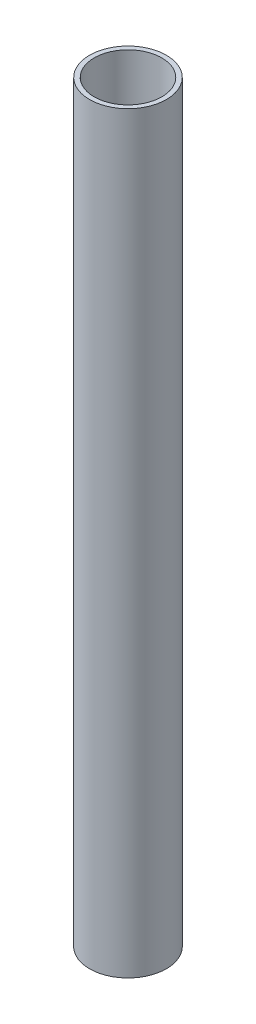
ISO-10303-21;
HEADER;
FILE_DESCRIPTION(('STEP AP214'),'2;1');
FILE_NAME('part.step','',(''),(''),'','','');
FILE_SCHEMA(('AUTOMOTIVE_DESIGN { 1 0 10303 214 1 1 1 1 }'));
ENDSEC;
DATA;
#1=APPLICATION_CONTEXT('core data for automotive mechanical design processes');
#2=APPLICATION_PROTOCOL_DEFINITION('international standard','automotive_design',2000,#1);
#3=PRODUCT_CONTEXT('',#1,'mechanical');
#4=PRODUCT('Part','Part','',(#3));
#5=PRODUCT_RELATED_PRODUCT_CATEGORY('part','',(#4));
#6=PRODUCT_DEFINITION_FORMATION('','',#4);
#7=PRODUCT_DEFINITION_CONTEXT('part definition',#1,'design');
#8=PRODUCT_DEFINITION('design','',#6,#7);
#9=PRODUCT_DEFINITION_SHAPE('','',#8);
#10=(LENGTH_UNIT() NAMED_UNIT(*) SI_UNIT(.MILLI.,.METRE.));
#11=(NAMED_UNIT(*) PLANE_ANGLE_UNIT() SI_UNIT($,.RADIAN.));
#12=(NAMED_UNIT(*) SI_UNIT($,.STERADIAN.) SOLID_ANGLE_UNIT());
#13=UNCERTAINTY_MEASURE_WITH_UNIT(LENGTH_MEASURE(1.E-05),#10,'distance_accuracy_value','');
#14=(GEOMETRIC_REPRESENTATION_CONTEXT(3) GLOBAL_UNCERTAINTY_ASSIGNED_CONTEXT((#13)) GLOBAL_UNIT_ASSIGNED_CONTEXT((#10,
#11,#12)) REPRESENTATION_CONTEXT('',''));
#15=CARTESIAN_POINT('',(0.,0.,0.));
#16=DIRECTION('',(0.,0.,1.));
#17=DIRECTION('',(1.,0.,0.));
#18=AXIS2_PLACEMENT_3D('',#15,#16,#17);
#19=CARTESIAN_POINT('',(0.,245.,0.));
#20=DIRECTION('',(0.,1.,0.));
#21=DIRECTION('',(0.,0.,1.));
#22=AXIS2_PLACEMENT_3D('',#19,#20,#21);
#23=PLANE('',#22);
#24=CARTESIAN_POINT('',(0.,245.,0.));
#25=DIRECTION('',(0.,1.,0.));
#26=DIRECTION('',(0.,0.,1.));
#27=AXIS2_PLACEMENT_3D('',#24,#25,#26);
#28=CIRCLE('',#27,12.5);
#29=CARTESIAN_POINT('',(0.,245.,12.5));
#30=VERTEX_POINT('',#29);
#31=EDGE_CURVE('E10',#30,#30,#28,.T.);
#32=ORIENTED_EDGE('',*,*,#31,.T.);
#33=EDGE_LOOP('',(#32));
#34=FACE_BOUND('',#33,.T.);
#35=CARTESIAN_POINT('',(0.,245.,0.));
#36=DIRECTION('',(0.,1.,0.));
#37=DIRECTION('',(0.,0.,1.));
#38=AXIS2_PLACEMENT_3D('',#35,#36,#37);
#39=CIRCLE('',#38,11.);
#40=CARTESIAN_POINT('',(0.,245.,11.));
#41=VERTEX_POINT('',#40);
#42=EDGE_CURVE('E43',#41,#41,#39,.T.);
#43=ORIENTED_EDGE('',*,*,#42,.F.);
#44=EDGE_LOOP('',(#43));
#45=FACE_BOUND('',#44,.T.);
#46=ADVANCED_FACE('F32',(#34,#45),#23,.T.);
#47=CARTESIAN_POINT('',(0.,0.,0.));
#48=DIRECTION('',(0.,1.,0.));
#49=DIRECTION('',(0.,0.,1.));
#50=AXIS2_PLACEMENT_3D('',#47,#48,#49);
#51=PLANE('',#50);
#52=CARTESIAN_POINT('',(0.,0.,0.));
#53=DIRECTION('',(0.,1.,0.));
#54=DIRECTION('',(0.,0.,1.));
#55=AXIS2_PLACEMENT_3D('',#52,#53,#54);
#56=CIRCLE('',#55,12.5);
#57=CARTESIAN_POINT('',(0.,0.,12.5));
#58=VERTEX_POINT('',#57);
#59=EDGE_CURVE('E36',#58,#58,#56,.T.);
#60=ORIENTED_EDGE('',*,*,#59,.F.);
#61=EDGE_LOOP('',(#60));
#62=FACE_BOUND('',#61,.T.);
#63=CARTESIAN_POINT('',(0.,0.,0.));
#64=DIRECTION('',(0.,1.,0.));
#65=DIRECTION('',(0.,0.,1.));
#66=AXIS2_PLACEMENT_3D('',#63,#64,#65);
#67=CIRCLE('',#66,11.);
#68=CARTESIAN_POINT('',(0.,0.,11.));
#69=VERTEX_POINT('',#68);
#70=EDGE_CURVE('E45',#69,#69,#67,.T.);
#71=ORIENTED_EDGE('',*,*,#70,.T.);
#72=EDGE_LOOP('',(#71));
#73=FACE_BOUND('',#72,.T.);
#74=ADVANCED_FACE('F55',(#62,#73),#51,.F.);
#75=CARTESIAN_POINT('',(0.,245.,0.));
#76=DIRECTION('',(0.,-1.,0.));
#77=DIRECTION('',(0.,0.,-1.));
#78=AXIS2_PLACEMENT_3D('',#75,#76,#77);
#79=CYLINDRICAL_SURFACE('',#78,12.5);
#80=ORIENTED_EDGE('',*,*,#31,.F.);
#81=EDGE_LOOP('',(#80));
#82=FACE_BOUND('',#81,.T.);
#83=ORIENTED_EDGE('',*,*,#59,.T.);
#84=EDGE_LOOP('',(#83));
#85=FACE_BOUND('',#84,.T.);
#86=ADVANCED_FACE('F34',(#82,#85),#79,.T.);
#87=CARTESIAN_POINT('',(0.,245.,0.));
#88=DIRECTION('',(0.,-1.,0.));
#89=DIRECTION('',(0.,0.,-1.));
#90=AXIS2_PLACEMENT_3D('',#87,#88,#89);
#91=CYLINDRICAL_SURFACE('',#90,11.);
#92=ORIENTED_EDGE('',*,*,#42,.T.);
#93=EDGE_LOOP('',(#92));
#94=FACE_BOUND('',#93,.T.);
#95=ORIENTED_EDGE('',*,*,#70,.F.);
#96=EDGE_LOOP('',(#95));
#97=FACE_BOUND('',#96,.T.);
#98=ADVANCED_FACE('F51',(#94,#97),#91,.F.);
#99=CLOSED_SHELL('',(#46,#74,#86,#98));
#100=MANIFOLD_SOLID_BREP('B2',#99);
#101=ADVANCED_BREP_SHAPE_REPRESENTATION('',(#18,#100),#14);
#102=SHAPE_DEFINITION_REPRESENTATION(#9,#101);
ENDSEC;
END-ISO-10303-21;
